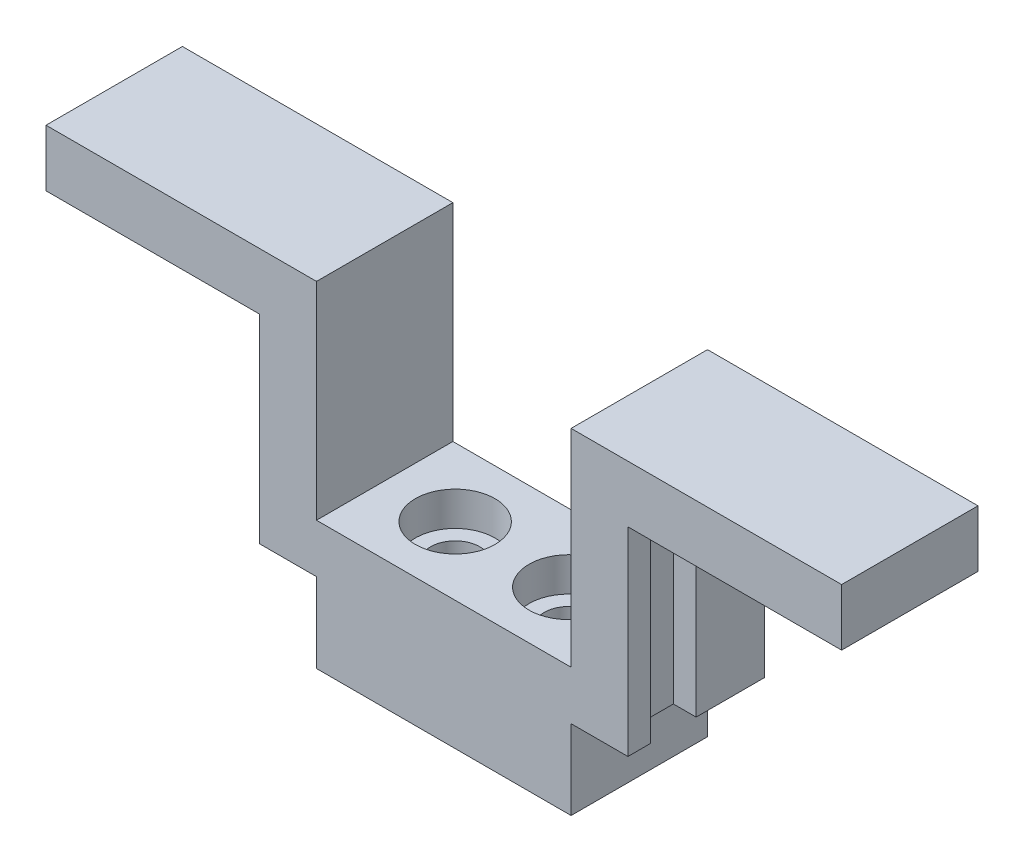
ISO-10303-21;
HEADER;
FILE_DESCRIPTION(('STEP AP214'),'2;1');
FILE_NAME('part.step','',(''),(''),'','','');
FILE_SCHEMA(('AUTOMOTIVE_DESIGN { 1 0 10303 214 1 1 1 1 }'));
ENDSEC;
DATA;
#1=APPLICATION_CONTEXT('core data for automotive mechanical design processes');
#2=APPLICATION_PROTOCOL_DEFINITION('international standard','automotive_design',2000,#1);
#3=PRODUCT_CONTEXT('',#1,'mechanical');
#4=PRODUCT('Part','Part','',(#3));
#5=PRODUCT_RELATED_PRODUCT_CATEGORY('part','',(#4));
#6=PRODUCT_DEFINITION_FORMATION('','',#4);
#7=PRODUCT_DEFINITION_CONTEXT('part definition',#1,'design');
#8=PRODUCT_DEFINITION('design','',#6,#7);
#9=PRODUCT_DEFINITION_SHAPE('','',#8);
#10=(LENGTH_UNIT() NAMED_UNIT(*) SI_UNIT(.MILLI.,.METRE.));
#11=(NAMED_UNIT(*) PLANE_ANGLE_UNIT() SI_UNIT($,.RADIAN.));
#12=(NAMED_UNIT(*) SI_UNIT($,.STERADIAN.) SOLID_ANGLE_UNIT());
#13=UNCERTAINTY_MEASURE_WITH_UNIT(LENGTH_MEASURE(1.E-05),#10,'distance_accuracy_value','');
#14=(GEOMETRIC_REPRESENTATION_CONTEXT(3) GLOBAL_UNCERTAINTY_ASSIGNED_CONTEXT((#13)) GLOBAL_UNIT_ASSIGNED_CONTEXT((#10,
#11,#12)) REPRESENTATION_CONTEXT('',''));
#15=CARTESIAN_POINT('',(0.,0.,0.));
#16=DIRECTION('',(0.,0.,1.));
#17=DIRECTION('',(1.,0.,0.));
#18=AXIS2_PLACEMENT_3D('',#15,#16,#17);
#19=CARTESIAN_POINT('',(-27.4,0.,12.));
#20=DIRECTION('',(-1.,0.,0.));
#21=DIRECTION('',(0.,0.,1.));
#22=AXIS2_PLACEMENT_3D('',#19,#20,#21);
#23=PLANE('',#22);
#24=DIRECTION('',(0.,0.,-1.));
#25=VECTOR('',#24,1.);
#26=CARTESIAN_POINT('',(-27.4,17.5,12.));
#27=LINE('',#26,#25);
#28=CARTESIAN_POINT('',(-27.4,17.5,12.));
#29=VERTEX_POINT('',#28);
#30=CARTESIAN_POINT('',(-27.4,17.5,10.));
#31=VERTEX_POINT('',#30);
#32=EDGE_CURVE('E304',#29,#31,#27,.T.);
#33=ORIENTED_EDGE('',*,*,#32,.T.);
#34=DIRECTION('',(0.,-1.,0.));
#35=VECTOR('',#34,1.);
#36=CARTESIAN_POINT('',(-27.4,17.5,10.));
#37=LINE('',#36,#35);
#38=CARTESIAN_POINT('',(-27.4,0.,10.));
#39=VERTEX_POINT('',#38);
#40=EDGE_CURVE('E217',#31,#39,#37,.T.);
#41=ORIENTED_EDGE('',*,*,#40,.T.);
#42=DIRECTION('',(0.,0.,-1.));
#43=VECTOR('',#42,1.);
#44=CARTESIAN_POINT('',(-27.4,0.,12.));
#45=LINE('',#44,#43);
#46=CARTESIAN_POINT('',(-27.4,0.,12.));
#47=VERTEX_POINT('',#46);
#48=EDGE_CURVE('E299',#47,#39,#45,.T.);
#49=ORIENTED_EDGE('',*,*,#48,.F.);
#50=DIRECTION('',(0.,1.,0.));
#51=VECTOR('',#50,1.);
#52=CARTESIAN_POINT('',(-27.4,0.,12.));
#53=LINE('',#52,#51);
#54=EDGE_CURVE('E266',#47,#29,#53,.T.);
#55=ORIENTED_EDGE('',*,*,#54,.T.);
#56=EDGE_LOOP('',(#33,#41,#49,#55));
#57=FACE_BOUND('',#56,.T.);
#58=ADVANCED_FACE('F39',(#57),#23,.T.);
#59=CARTESIAN_POINT('',(-27.4,0.,6.));
#60=VERTEX_POINT('',#59);
#61=CARTESIAN_POINT('',(-27.4,0.,0.));
#62=VERTEX_POINT('',#61);
#63=EDGE_CURVE('E298',#60,#62,#45,.T.);
#64=ORIENTED_EDGE('',*,*,#63,.F.);
#65=DIRECTION('',(0.,1.,0.));
#66=VECTOR('',#65,1.);
#67=CARTESIAN_POINT('',(-27.4,17.5,6.));
#68=LINE('',#67,#66);
#69=CARTESIAN_POINT('',(-27.4,17.5,6.));
#70=VERTEX_POINT('',#69);
#71=EDGE_CURVE('E225',#60,#70,#68,.T.);
#72=ORIENTED_EDGE('',*,*,#71,.T.);
#73=CARTESIAN_POINT('',(-27.4,17.5,0.));
#74=VERTEX_POINT('',#73);
#75=EDGE_CURVE('E303',#70,#74,#27,.T.);
#76=ORIENTED_EDGE('',*,*,#75,.T.);
#77=DIRECTION('',(0.,1.,0.));
#78=VECTOR('',#77,1.);
#79=CARTESIAN_POINT('',(-27.4,0.,0.));
#80=LINE('',#79,#78);
#81=EDGE_CURVE('E290',#62,#74,#80,.T.);
#82=ORIENTED_EDGE('',*,*,#81,.F.);
#83=EDGE_LOOP('',(#64,#72,#76,#82));
#84=FACE_BOUND('',#83,.T.);
#85=ADVANCED_FACE('F504',(#84),#23,.T.);
#86=CARTESIAN_POINT('',(-22.4,0.,12.));
#87=DIRECTION('',(0.,-1.,0.));
#88=DIRECTION('',(0.,0.,-1.));
#89=AXIS2_PLACEMENT_3D('',#86,#87,#88);
#90=PLANE('',#89);
#91=ORIENTED_EDGE('',*,*,#48,.T.);
#92=DIRECTION('',(-1.,0.,0.));
#93=VECTOR('',#92,1.);
#94=CARTESIAN_POINT('',(-25.4,0.,10.));
#95=LINE('',#94,#93);
#96=CARTESIAN_POINT('',(-25.4,0.,10.));
#97=VERTEX_POINT('',#96);
#98=EDGE_CURVE('E241',#97,#39,#95,.T.);
#99=ORIENTED_EDGE('',*,*,#98,.F.);
#100=DIRECTION('',(0.,0.,-1.));
#101=VECTOR('',#100,1.);
#102=CARTESIAN_POINT('',(-25.4,0.,10.));
#103=LINE('',#102,#101);
#104=CARTESIAN_POINT('',(-25.4,0.,6.));
#105=VERTEX_POINT('',#104);
#106=EDGE_CURVE('E220',#97,#105,#103,.T.);
#107=ORIENTED_EDGE('',*,*,#106,.T.);
#108=DIRECTION('',(-1.,0.,0.));
#109=VECTOR('',#108,1.);
#110=CARTESIAN_POINT('',(-25.4,0.,6.));
#111=LINE('',#110,#109);
#112=EDGE_CURVE('E245',#105,#60,#111,.T.);
#113=ORIENTED_EDGE('',*,*,#112,.T.);
#114=ORIENTED_EDGE('',*,*,#63,.T.);
#115=DIRECTION('',(-1.,0.,0.));
#116=VECTOR('',#115,1.);
#117=CARTESIAN_POINT('',(-22.4,0.,0.));
#118=LINE('',#117,#116);
#119=CARTESIAN_POINT('',(-22.4,0.,0.));
#120=VERTEX_POINT('',#119);
#121=EDGE_CURVE('E63',#120,#62,#118,.T.);
#122=ORIENTED_EDGE('',*,*,#121,.F.);
#123=DIRECTION('',(0.,0.,-1.));
#124=VECTOR('',#123,1.);
#125=CARTESIAN_POINT('',(-22.4,0.,12.));
#126=LINE('',#125,#124);
#127=CARTESIAN_POINT('',(-22.4,0.,12.));
#128=VERTEX_POINT('',#127);
#129=EDGE_CURVE('E274',#128,#120,#126,.T.);
#130=ORIENTED_EDGE('',*,*,#129,.F.);
#131=DIRECTION('',(-1.,0.,0.));
#132=VECTOR('',#131,1.);
#133=CARTESIAN_POINT('',(-22.4,0.,12.));
#134=LINE('',#133,#132);
#135=EDGE_CURVE('E270',#128,#47,#134,.T.);
#136=ORIENTED_EDGE('',*,*,#135,.T.);
#137=EDGE_LOOP('',(#91,#99,#107,#113,#114,#122,#130,#136));
#138=FACE_BOUND('',#137,.T.);
#139=ADVANCED_FACE('F502',(#138),#90,.T.);
#140=CARTESIAN_POINT('',(0.,17.5,12.));
#141=DIRECTION('',(1.,0.,0.));
#142=DIRECTION('',(0.,0.,-1.));
#143=AXIS2_PLACEMENT_3D('',#140,#141,#142);
#144=PLANE('',#143);
#145=DIRECTION('',(0.,0.,-1.));
#146=VECTOR('',#145,1.);
#147=CARTESIAN_POINT('',(0.,4.3,0.));
#148=LINE('',#147,#146);
#149=CARTESIAN_POINT('',(0.,4.3,12.));
#150=VERTEX_POINT('',#149);
#151=CARTESIAN_POINT('',(0.,4.3,0.));
#152=VERTEX_POINT('',#151);
#153=EDGE_CURVE('E340',#150,#152,#148,.T.);
#154=ORIENTED_EDGE('',*,*,#153,.F.);
#155=DIRECTION('',(0.,-1.,0.));
#156=VECTOR('',#155,1.);
#157=CARTESIAN_POINT('',(0.,0.,12.));
#158=LINE('',#157,#156);
#159=CARTESIAN_POINT('',(0.,22.5,12.));
#160=VERTEX_POINT('',#159);
#161=EDGE_CURVE('E397',#160,#150,#158,.T.);
#162=ORIENTED_EDGE('',*,*,#161,.F.);
#163=DIRECTION('',(0.,0.,-1.));
#164=VECTOR('',#163,1.);
#165=CARTESIAN_POINT('',(0.,22.5,12.));
#166=LINE('',#165,#164);
#167=CARTESIAN_POINT('',(0.,22.5,0.));
#168=VERTEX_POINT('',#167);
#169=EDGE_CURVE('E418',#160,#168,#166,.T.);
#170=ORIENTED_EDGE('',*,*,#169,.T.);
#171=DIRECTION('',(0.,-1.,0.));
#172=VECTOR('',#171,1.);
#173=CARTESIAN_POINT('',(0.,17.5,0.));
#174=LINE('',#173,#172);
#175=EDGE_CURVE('E402',#168,#152,#174,.T.);
#176=ORIENTED_EDGE('',*,*,#175,.T.);
#177=EDGE_LOOP('',(#154,#162,#170,#176));
#178=FACE_BOUND('',#177,.T.);
#179=ADVANCED_FACE('F534',(#178),#144,.F.);
#180=CARTESIAN_POINT('',(5.,0.,12.));
#181=DIRECTION('',(-1.,0.,0.));
#182=DIRECTION('',(0.,0.,1.));
#183=AXIS2_PLACEMENT_3D('',#180,#181,#182);
#184=PLANE('',#183);
#185=DIRECTION('',(0.,0.,-1.));
#186=VECTOR('',#185,1.);
#187=CARTESIAN_POINT('',(5.,0.,12.));
#188=LINE('',#187,#186);
#189=CARTESIAN_POINT('',(5.,0.,12.));
#190=VERTEX_POINT('',#189);
#191=CARTESIAN_POINT('',(5.,0.,10.));
#192=VERTEX_POINT('',#191);
#193=EDGE_CURVE('E48',#190,#192,#188,.T.);
#194=ORIENTED_EDGE('',*,*,#193,.T.);
#195=DIRECTION('',(0.,-1.,0.));
#196=VECTOR('',#195,1.);
#197=CARTESIAN_POINT('',(5.,17.5,10.));
#198=LINE('',#197,#196);
#199=CARTESIAN_POINT('',(5.,17.5,10.));
#200=VERTEX_POINT('',#199);
#201=EDGE_CURVE('E360',#200,#192,#198,.T.);
#202=ORIENTED_EDGE('',*,*,#201,.F.);
#203=DIRECTION('',(0.,0.,-1.));
#204=VECTOR('',#203,1.);
#205=CARTESIAN_POINT('',(5.,17.5,12.));
#206=LINE('',#205,#204);
#207=CARTESIAN_POINT('',(5.,17.5,12.));
#208=VERTEX_POINT('',#207);
#209=EDGE_CURVE('E449',#208,#200,#206,.T.);
#210=ORIENTED_EDGE('',*,*,#209,.F.);
#211=DIRECTION('',(0.,1.,0.));
#212=VECTOR('',#211,1.);
#213=CARTESIAN_POINT('',(5.,0.,12.));
#214=LINE('',#213,#212);
#215=EDGE_CURVE('E405',#190,#208,#214,.T.);
#216=ORIENTED_EDGE('',*,*,#215,.F.);
#217=EDGE_LOOP('',(#194,#202,#210,#216));
#218=FACE_BOUND('',#217,.T.);
#219=ADVANCED_FACE('F491',(#218),#184,.F.);
#220=CARTESIAN_POINT('',(0.,0.,12.));
#221=DIRECTION('',(0.,1.,0.));
#222=DIRECTION('',(0.,0.,1.));
#223=AXIS2_PLACEMENT_3D('',#220,#221,#222);
#224=PLANE('',#223);
#225=DIRECTION('',(0.,0.,-1.));
#226=VECTOR('',#225,1.);
#227=CARTESIAN_POINT('',(3.,0.,10.));
#228=LINE('',#227,#226);
#229=CARTESIAN_POINT('',(3.,0.,10.));
#230=VERTEX_POINT('',#229);
#231=CARTESIAN_POINT('',(3.,0.,6.));
#232=VERTEX_POINT('',#231);
#233=EDGE_CURVE('E365',#230,#232,#228,.T.);
#234=ORIENTED_EDGE('',*,*,#233,.F.);
#235=DIRECTION('',(1.,0.,0.));
#236=VECTOR('',#235,1.);
#237=CARTESIAN_POINT('',(3.,0.,10.));
#238=LINE('',#237,#236);
#239=EDGE_CURVE('E378',#230,#192,#238,.T.);
#240=ORIENTED_EDGE('',*,*,#239,.T.);
#241=ORIENTED_EDGE('',*,*,#193,.F.);
#242=DIRECTION('',(1.,0.,0.));
#243=VECTOR('',#242,1.);
#244=CARTESIAN_POINT('',(0.,0.,12.));
#245=LINE('',#244,#243);
#246=CARTESIAN_POINT('',(0.,0.,12.));
#247=VERTEX_POINT('',#246);
#248=EDGE_CURVE('E401',#247,#190,#245,.T.);
#249=ORIENTED_EDGE('',*,*,#248,.F.);
#250=DIRECTION('',(0.,0.,-1.));
#251=VECTOR('',#250,1.);
#252=CARTESIAN_POINT('',(0.,0.,12.));
#253=LINE('',#252,#251);
#254=CARTESIAN_POINT('',(0.,0.,0.));
#255=VERTEX_POINT('',#254);
#256=EDGE_CURVE('E11',#247,#255,#253,.T.);
#257=ORIENTED_EDGE('',*,*,#256,.T.);
#258=DIRECTION('',(1.,0.,0.));
#259=VECTOR('',#258,1.);
#260=CARTESIAN_POINT('',(0.,0.,0.));
#261=LINE('',#260,#259);
#262=CARTESIAN_POINT('',(5.,0.,0.));
#263=VERTEX_POINT('',#262);
#264=EDGE_CURVE('E386',#255,#263,#261,.T.);
#265=ORIENTED_EDGE('',*,*,#264,.T.);
#266=CARTESIAN_POINT('',(5.,0.,6.));
#267=VERTEX_POINT('',#266);
#268=EDGE_CURVE('E452',#267,#263,#188,.T.);
#269=ORIENTED_EDGE('',*,*,#268,.F.);
#270=DIRECTION('',(1.,0.,0.));
#271=VECTOR('',#270,1.);
#272=CARTESIAN_POINT('',(3.,0.,6.));
#273=LINE('',#272,#271);
#274=EDGE_CURVE('E391',#232,#267,#273,.T.);
#275=ORIENTED_EDGE('',*,*,#274,.F.);
#276=EDGE_LOOP('',(#234,#240,#241,#249,#257,#265,#269,#275));
#277=FACE_BOUND('',#276,.T.);
#278=ADVANCED_FACE('F41',(#277),#224,.F.);
#279=CARTESIAN_POINT('',(5.,17.5,6.));
#280=VERTEX_POINT('',#279);
#281=CARTESIAN_POINT('',(5.,17.5,0.));
#282=VERTEX_POINT('',#281);
#283=EDGE_CURVE('E448',#280,#282,#206,.T.);
#284=ORIENTED_EDGE('',*,*,#283,.F.);
#285=DIRECTION('',(0.,1.,0.));
#286=VECTOR('',#285,1.);
#287=CARTESIAN_POINT('',(5.,17.5,6.));
#288=LINE('',#287,#286);
#289=EDGE_CURVE('E366',#267,#280,#288,.T.);
#290=ORIENTED_EDGE('',*,*,#289,.F.);
#291=ORIENTED_EDGE('',*,*,#268,.T.);
#292=DIRECTION('',(0.,1.,0.));
#293=VECTOR('',#292,1.);
#294=CARTESIAN_POINT('',(5.,0.,0.));
#295=LINE('',#294,#293);
#296=EDGE_CURVE('E422',#263,#282,#295,.T.);
#297=ORIENTED_EDGE('',*,*,#296,.T.);
#298=EDGE_LOOP('',(#284,#290,#291,#297));
#299=FACE_BOUND('',#298,.T.);
#300=ADVANCED_FACE('F464',(#299),#184,.F.);
#301=CARTESIAN_POINT('',(5.,17.5,12.));
#302=DIRECTION('',(0.,1.,0.));
#303=DIRECTION('',(0.,0.,1.));
#304=AXIS2_PLACEMENT_3D('',#301,#302,#303);
#305=PLANE('',#304);
#306=DIRECTION('',(1.,0.,0.));
#307=VECTOR('',#306,1.);
#308=CARTESIAN_POINT('',(5.,17.5,0.));
#309=LINE('',#308,#307);
#310=CARTESIAN_POINT('',(23.8,17.5,0.));
#311=VERTEX_POINT('',#310);
#312=EDGE_CURVE('E426',#282,#311,#309,.T.);
#313=ORIENTED_EDGE('',*,*,#312,.T.);
#314=DIRECTION('',(0.,0.,-1.));
#315=VECTOR('',#314,1.);
#316=CARTESIAN_POINT('',(23.8,17.5,12.));
#317=LINE('',#316,#315);
#318=CARTESIAN_POINT('',(23.8,17.5,12.));
#319=VERTEX_POINT('',#318);
#320=EDGE_CURVE('E444',#319,#311,#317,.T.);
#321=ORIENTED_EDGE('',*,*,#320,.F.);
#322=DIRECTION('',(1.,0.,0.));
#323=VECTOR('',#322,1.);
#324=CARTESIAN_POINT('',(5.,17.5,12.));
#325=LINE('',#324,#323);
#326=EDGE_CURVE('E408',#208,#319,#325,.T.);
#327=ORIENTED_EDGE('',*,*,#326,.F.);
#328=ORIENTED_EDGE('',*,*,#209,.T.);
#329=DIRECTION('',(1.,0.,0.));
#330=VECTOR('',#329,1.);
#331=CARTESIAN_POINT('',(3.,17.5,10.));
#332=LINE('',#331,#330);
#333=CARTESIAN_POINT('',(3.,17.5,10.));
#334=VERTEX_POINT('',#333);
#335=EDGE_CURVE('E383',#334,#200,#332,.T.);
#336=ORIENTED_EDGE('',*,*,#335,.F.);
#337=DIRECTION('',(0.,0.,1.));
#338=VECTOR('',#337,1.);
#339=CARTESIAN_POINT('',(3.,17.5,10.));
#340=LINE('',#339,#338);
#341=CARTESIAN_POINT('',(3.,17.5,6.));
#342=VERTEX_POINT('',#341);
#343=EDGE_CURVE('E374',#342,#334,#340,.T.);
#344=ORIENTED_EDGE('',*,*,#343,.F.);
#345=DIRECTION('',(1.,0.,0.));
#346=VECTOR('',#345,1.);
#347=CARTESIAN_POINT('',(3.,17.5,6.));
#348=LINE('',#347,#346);
#349=EDGE_CURVE('E387',#342,#280,#348,.T.);
#350=ORIENTED_EDGE('',*,*,#349,.T.);
#351=ORIENTED_EDGE('',*,*,#283,.T.);
#352=EDGE_LOOP('',(#313,#321,#327,#328,#336,#344,#350,#351));
#353=FACE_BOUND('',#352,.T.);
#354=ADVANCED_FACE('F478',(#353),#305,.F.);
#355=CARTESIAN_POINT('',(23.8,17.5,12.));
#356=DIRECTION('',(-1.,0.,0.));
#357=DIRECTION('',(0.,0.,1.));
#358=AXIS2_PLACEMENT_3D('',#355,#356,#357);
#359=PLANE('',#358);
#360=DIRECTION('',(0.,1.,0.));
#361=VECTOR('',#360,1.);
#362=CARTESIAN_POINT('',(23.8,17.5,0.));
#363=LINE('',#362,#361);
#364=CARTESIAN_POINT('',(23.8,22.5,0.));
#365=VERTEX_POINT('',#364);
#366=EDGE_CURVE('E429',#311,#365,#363,.T.);
#367=ORIENTED_EDGE('',*,*,#366,.T.);
#368=DIRECTION('',(0.,0.,-1.));
#369=VECTOR('',#368,1.);
#370=CARTESIAN_POINT('',(23.8,22.5,12.));
#371=LINE('',#370,#369);
#372=CARTESIAN_POINT('',(23.8,22.5,12.));
#373=VERTEX_POINT('',#372);
#374=EDGE_CURVE('E440',#373,#365,#371,.T.);
#375=ORIENTED_EDGE('',*,*,#374,.F.);
#376=DIRECTION('',(0.,1.,0.));
#377=VECTOR('',#376,1.);
#378=CARTESIAN_POINT('',(23.8,17.5,12.));
#379=LINE('',#378,#377);
#380=EDGE_CURVE('E411',#319,#373,#379,.T.);
#381=ORIENTED_EDGE('',*,*,#380,.F.);
#382=ORIENTED_EDGE('',*,*,#320,.T.);
#383=EDGE_LOOP('',(#367,#375,#381,#382));
#384=FACE_BOUND('',#383,.T.);
#385=ADVANCED_FACE('F482',(#384),#359,.F.);
#386=CARTESIAN_POINT('',(0.,22.5,12.));
#387=DIRECTION('',(0.,-1.,0.));
#388=DIRECTION('',(0.,0.,-1.));
#389=AXIS2_PLACEMENT_3D('',#386,#387,#388);
#390=PLANE('',#389);
#391=DIRECTION('',(-1.,0.,0.));
#392=VECTOR('',#391,1.);
#393=CARTESIAN_POINT('',(0.,22.5,0.));
#394=LINE('',#393,#392);
#395=EDGE_CURVE('E432',#365,#168,#394,.T.);
#396=ORIENTED_EDGE('',*,*,#395,.T.);
#397=ORIENTED_EDGE('',*,*,#169,.F.);
#398=DIRECTION('',(-1.,0.,0.));
#399=VECTOR('',#398,1.);
#400=CARTESIAN_POINT('',(0.,22.5,12.));
#401=LINE('',#400,#399);
#402=EDGE_CURVE('E414',#373,#160,#401,.T.);
#403=ORIENTED_EDGE('',*,*,#402,.F.);
#404=ORIENTED_EDGE('',*,*,#374,.T.);
#405=EDGE_LOOP('',(#396,#397,#403,#404));
#406=FACE_BOUND('',#405,.T.);
#407=ADVANCED_FACE('F536',(#406),#390,.F.);
#408=CARTESIAN_POINT('',(0.,0.,12.));
#409=DIRECTION('',(0.,0.,-1.));
#410=DIRECTION('',(-1.,0.,0.));
#411=AXIS2_PLACEMENT_3D('',#408,#409,#410);
#412=PLANE('',#411);
#413=ORIENTED_EDGE('',*,*,#161,.T.);
#414=DIRECTION('',(1.,0.,0.));
#415=VECTOR('',#414,1.);
#416=CARTESIAN_POINT('',(-11.2,4.3,12.));
#417=LINE('',#416,#415);
#418=CARTESIAN_POINT('',(-22.4,4.3,12.));
#419=VERTEX_POINT('',#418);
#420=EDGE_CURVE('E348',#419,#150,#417,.T.);
#421=ORIENTED_EDGE('',*,*,#420,.F.);
#422=DIRECTION('',(0.,-1.,0.));
#423=VECTOR('',#422,1.);
#424=CARTESIAN_POINT('',(-22.4,0.,12.));
#425=LINE('',#424,#423);
#426=CARTESIAN_POINT('',(-22.4,22.5,12.));
#427=VERTEX_POINT('',#426);
#428=EDGE_CURVE('E251',#427,#419,#425,.T.);
#429=ORIENTED_EDGE('',*,*,#428,.F.);
#430=DIRECTION('',(1.,0.,0.));
#431=VECTOR('',#430,1.);
#432=CARTESIAN_POINT('',(-22.4,22.5,12.));
#433=LINE('',#432,#431);
#434=CARTESIAN_POINT('',(-46.2,22.5,12.));
#435=VERTEX_POINT('',#434);
#436=EDGE_CURVE('E254',#435,#427,#433,.T.);
#437=ORIENTED_EDGE('',*,*,#436,.F.);
#438=DIRECTION('',(0.,1.,0.));
#439=VECTOR('',#438,1.);
#440=CARTESIAN_POINT('',(-46.2,17.5,12.));
#441=LINE('',#440,#439);
#442=CARTESIAN_POINT('',(-46.2,17.5,12.));
#443=VERTEX_POINT('',#442);
#444=EDGE_CURVE('E258',#443,#435,#441,.T.);
#445=ORIENTED_EDGE('',*,*,#444,.F.);
#446=DIRECTION('',(-1.,0.,0.));
#447=VECTOR('',#446,1.);
#448=CARTESIAN_POINT('',(-27.4,17.5,12.));
#449=LINE('',#448,#447);
#450=EDGE_CURVE('E262',#29,#443,#449,.T.);
#451=ORIENTED_EDGE('',*,*,#450,.F.);
#452=ORIENTED_EDGE('',*,*,#54,.F.);
#453=ORIENTED_EDGE('',*,*,#135,.F.);
#454=DIRECTION('',(0.,1.,0.));
#455=VECTOR('',#454,1.);
#456=CARTESIAN_POINT('',(-22.4,4.3,12.));
#457=LINE('',#456,#455);
#458=CARTESIAN_POINT('',(-22.4,-7.,12.));
#459=VERTEX_POINT('',#458);
#460=EDGE_CURVE('E322',#459,#128,#457,.T.);
#461=ORIENTED_EDGE('',*,*,#460,.F.);
#462=DIRECTION('',(1.,0.,0.));
#463=VECTOR('',#462,1.);
#464=CARTESIAN_POINT('',(-11.2,-7.,12.));
#465=LINE('',#464,#463);
#466=CARTESIAN_POINT('',(0.,-7.,12.));
#467=VERTEX_POINT('',#466);
#468=EDGE_CURVE('E352',#459,#467,#465,.T.);
#469=ORIENTED_EDGE('',*,*,#468,.T.);
#470=DIRECTION('',(0.,1.,0.));
#471=VECTOR('',#470,1.);
#472=CARTESIAN_POINT('',(0.,4.3,12.));
#473=LINE('',#472,#471);
#474=EDGE_CURVE('E336',#467,#247,#473,.T.);
#475=ORIENTED_EDGE('',*,*,#474,.T.);
#476=ORIENTED_EDGE('',*,*,#248,.T.);
#477=ORIENTED_EDGE('',*,*,#215,.T.);
#478=ORIENTED_EDGE('',*,*,#326,.T.);
#479=ORIENTED_EDGE('',*,*,#380,.T.);
#480=ORIENTED_EDGE('',*,*,#402,.T.);
#481=EDGE_LOOP('',(#413,#421,#429,#437,#445,#451,#452,#453,#461,#469,#475,#476,#477,#478,#479,#480));
#482=FACE_BOUND('',#481,.T.);
#483=ADVANCED_FACE('F486',(#482),#412,.F.);
#484=CARTESIAN_POINT('',(0.,0.,0.));
#485=DIRECTION('',(0.,0.,-1.));
#486=DIRECTION('',(-1.,0.,0.));
#487=AXIS2_PLACEMENT_3D('',#484,#485,#486);
#488=PLANE('',#487);
#489=ORIENTED_EDGE('',*,*,#264,.F.);
#490=DIRECTION('',(0.,-1.,0.));
#491=VECTOR('',#490,1.);
#492=CARTESIAN_POINT('',(0.,4.3,0.));
#493=LINE('',#492,#491);
#494=CARTESIAN_POINT('',(0.,-7.,0.));
#495=VERTEX_POINT('',#494);
#496=EDGE_CURVE('E330',#255,#495,#493,.T.);
#497=ORIENTED_EDGE('',*,*,#496,.T.);
#498=DIRECTION('',(1.,0.,0.));
#499=VECTOR('',#498,1.);
#500=CARTESIAN_POINT('',(-11.2,-7.,0.));
#501=LINE('',#500,#499);
#502=CARTESIAN_POINT('',(-22.4,-7.,0.));
#503=VERTEX_POINT('',#502);
#504=EDGE_CURVE('E356',#503,#495,#501,.T.);
#505=ORIENTED_EDGE('',*,*,#504,.F.);
#506=DIRECTION('',(0.,-1.,0.));
#507=VECTOR('',#506,1.);
#508=CARTESIAN_POINT('',(-22.4,4.3,0.));
#509=LINE('',#508,#507);
#510=EDGE_CURVE('E316',#120,#503,#509,.T.);
#511=ORIENTED_EDGE('',*,*,#510,.F.);
#512=ORIENTED_EDGE('',*,*,#121,.T.);
#513=ORIENTED_EDGE('',*,*,#81,.T.);
#514=DIRECTION('',(-1.,0.,0.));
#515=VECTOR('',#514,1.);
#516=CARTESIAN_POINT('',(-27.4,17.5,0.));
#517=LINE('',#516,#515);
#518=CARTESIAN_POINT('',(-46.2,17.5,0.));
#519=VERTEX_POINT('',#518);
#520=EDGE_CURVE('E286',#74,#519,#517,.T.);
#521=ORIENTED_EDGE('',*,*,#520,.T.);
#522=DIRECTION('',(0.,1.,0.));
#523=VECTOR('',#522,1.);
#524=CARTESIAN_POINT('',(-46.2,17.5,0.));
#525=LINE('',#524,#523);
#526=CARTESIAN_POINT('',(-46.2,22.5,0.));
#527=VERTEX_POINT('',#526);
#528=EDGE_CURVE('E282',#519,#527,#525,.T.);
#529=ORIENTED_EDGE('',*,*,#528,.T.);
#530=DIRECTION('',(1.,0.,0.));
#531=VECTOR('',#530,1.);
#532=CARTESIAN_POINT('',(-22.4,22.5,0.));
#533=LINE('',#532,#531);
#534=CARTESIAN_POINT('',(-22.4,22.5,0.));
#535=VERTEX_POINT('',#534);
#536=EDGE_CURVE('E278',#527,#535,#533,.T.);
#537=ORIENTED_EDGE('',*,*,#536,.T.);
#538=DIRECTION('',(0.,-1.,0.));
#539=VECTOR('',#538,1.);
#540=CARTESIAN_POINT('',(-22.4,17.5,0.));
#541=LINE('',#540,#539);
#542=CARTESIAN_POINT('',(-22.4,4.3,0.));
#543=VERTEX_POINT('',#542);
#544=EDGE_CURVE('E244',#535,#543,#541,.T.);
#545=ORIENTED_EDGE('',*,*,#544,.T.);
#546=DIRECTION('',(1.,0.,0.));
#547=VECTOR('',#546,1.);
#548=CARTESIAN_POINT('',(-11.2,4.3,0.));
#549=LINE('',#548,#547);
#550=EDGE_CURVE('E344',#543,#152,#549,.T.);
#551=ORIENTED_EDGE('',*,*,#550,.T.);
#552=ORIENTED_EDGE('',*,*,#175,.F.);
#553=ORIENTED_EDGE('',*,*,#395,.F.);
#554=ORIENTED_EDGE('',*,*,#366,.F.);
#555=ORIENTED_EDGE('',*,*,#312,.F.);
#556=ORIENTED_EDGE('',*,*,#296,.F.);
#557=EDGE_LOOP('',(#489,#497,#505,#511,#512,#513,#521,#529,#537,#545,#551,#552,#553,#554,#555,#556));
#558=FACE_BOUND('',#557,.T.);
#559=ADVANCED_FACE('F473',(#558),#488,.T.);
#560=CARTESIAN_POINT('',(3.,17.5,10.));
#561=DIRECTION('',(0.,0.,1.));
#562=DIRECTION('',(0.,-1.,0.));
#563=AXIS2_PLACEMENT_3D('',#560,#561,#562);
#564=PLANE('',#563);
#565=ORIENTED_EDGE('',*,*,#201,.T.);
#566=ORIENTED_EDGE('',*,*,#239,.F.);
#567=DIRECTION('',(0.,-1.,0.));
#568=VECTOR('',#567,1.);
#569=CARTESIAN_POINT('',(3.,17.5,10.));
#570=LINE('',#569,#568);
#571=EDGE_CURVE('E361',#334,#230,#570,.T.);
#572=ORIENTED_EDGE('',*,*,#571,.F.);
#573=ORIENTED_EDGE('',*,*,#335,.T.);
#574=EDGE_LOOP('',(#565,#566,#572,#573));
#575=FACE_BOUND('',#574,.T.);
#576=ADVANCED_FACE('F493',(#575),#564,.F.);
#577=CARTESIAN_POINT('',(3.,17.5,6.));
#578=DIRECTION('',(0.,0.,-1.));
#579=DIRECTION('',(0.,1.,0.));
#580=AXIS2_PLACEMENT_3D('',#577,#578,#579);
#581=PLANE('',#580);
#582=ORIENTED_EDGE('',*,*,#289,.T.);
#583=ORIENTED_EDGE('',*,*,#349,.F.);
#584=DIRECTION('',(0.,1.,0.));
#585=VECTOR('',#584,1.);
#586=CARTESIAN_POINT('',(3.,17.5,6.));
#587=LINE('',#586,#585);
#588=EDGE_CURVE('E370',#232,#342,#587,.T.);
#589=ORIENTED_EDGE('',*,*,#588,.F.);
#590=ORIENTED_EDGE('',*,*,#274,.T.);
#591=EDGE_LOOP('',(#582,#583,#589,#590));
#592=FACE_BOUND('',#591,.T.);
#593=ADVANCED_FACE('F577',(#592),#581,.F.);
#594=CARTESIAN_POINT('',(3.,0.,0.));
#595=DIRECTION('',(1.,0.,0.));
#596=DIRECTION('',(0.,0.,-1.));
#597=AXIS2_PLACEMENT_3D('',#594,#595,#596);
#598=PLANE('',#597);
#599=ORIENTED_EDGE('',*,*,#571,.T.);
#600=ORIENTED_EDGE('',*,*,#233,.T.);
#601=ORIENTED_EDGE('',*,*,#588,.T.);
#602=ORIENTED_EDGE('',*,*,#343,.T.);
#603=EDGE_LOOP('',(#599,#600,#601,#602));
#604=FACE_BOUND('',#603,.T.);
#605=ADVANCED_FACE('F495',(#604),#598,.T.);
#606=CARTESIAN_POINT('',(-11.2,-7.,0.));
#607=DIRECTION('',(0.,1.,0.));
#608=DIRECTION('',(0.,0.,1.));
#609=AXIS2_PLACEMENT_3D('',#606,#607,#608);
#610=PLANE('',#609);
#611=CARTESIAN_POINT('',(-16.2,-7.,6.));
#612=DIRECTION('',(0.,1.,0.));
#613=DIRECTION('',(0.,0.,1.));
#614=AXIS2_PLACEMENT_3D('',#611,#612,#613);
#615=CIRCLE('',#614,2.165);
#616=CARTESIAN_POINT('',(-16.2,-7.,8.165));
#617=VERTEX_POINT('',#616);
#618=EDGE_CURVE('E842',#617,#617,#615,.T.);
#619=ORIENTED_EDGE('',*,*,#618,.T.);
#620=EDGE_LOOP('',(#619));
#621=FACE_BOUND('',#620,.T.);
#622=CARTESIAN_POINT('',(-6.2,-7.,6.));
#623=DIRECTION('',(0.,1.,0.));
#624=DIRECTION('',(0.,0.,1.));
#625=AXIS2_PLACEMENT_3D('',#622,#623,#624);
#626=CIRCLE('',#625,2.165);
#627=CARTESIAN_POINT('',(-6.2,-7.,8.165));
#628=VERTEX_POINT('',#627);
#629=EDGE_CURVE('E847',#628,#628,#626,.T.);
#630=ORIENTED_EDGE('',*,*,#629,.T.);
#631=EDGE_LOOP('',(#630));
#632=FACE_BOUND('',#631,.T.);
#633=DIRECTION('',(0.,0.,1.));
#634=VECTOR('',#633,1.);
#635=CARTESIAN_POINT('',(0.,-7.,0.));
#636=LINE('',#635,#634);
#637=EDGE_CURVE('E333',#495,#467,#636,.T.);
#638=ORIENTED_EDGE('',*,*,#637,.T.);
#639=ORIENTED_EDGE('',*,*,#468,.F.);
#640=DIRECTION('',(0.,0.,1.));
#641=VECTOR('',#640,1.);
#642=CARTESIAN_POINT('',(-22.4,-7.,0.));
#643=LINE('',#642,#641);
#644=EDGE_CURVE('E326',#503,#459,#643,.T.);
#645=ORIENTED_EDGE('',*,*,#644,.F.);
#646=ORIENTED_EDGE('',*,*,#504,.T.);
#647=EDGE_LOOP('',(#638,#639,#645,#646));
#648=FACE_BOUND('',#647,.T.);
#649=ADVANCED_FACE('F570',(#621,#632,#648),#610,.F.);
#650=CARTESIAN_POINT('',(-11.2,4.3,0.));
#651=DIRECTION('',(0.,-1.,0.));
#652=DIRECTION('',(0.,0.,-1.));
#653=AXIS2_PLACEMENT_3D('',#650,#651,#652);
#654=PLANE('',#653);
#655=CARTESIAN_POINT('',(-16.2,4.3,6.));
#656=DIRECTION('',(0.,1.,0.));
#657=DIRECTION('',(0.,0.,1.));
#658=AXIS2_PLACEMENT_3D('',#655,#656,#657);
#659=CIRCLE('',#658,3.5);
#660=CARTESIAN_POINT('',(-16.2,4.3,9.5));
#661=VERTEX_POINT('',#660);
#662=EDGE_CURVE('E862',#661,#661,#659,.T.);
#663=ORIENTED_EDGE('',*,*,#662,.F.);
#664=EDGE_LOOP('',(#663));
#665=FACE_BOUND('',#664,.T.);
#666=CARTESIAN_POINT('',(-6.2,4.3,6.));
#667=DIRECTION('',(0.,1.,0.));
#668=DIRECTION('',(0.,0.,1.));
#669=AXIS2_PLACEMENT_3D('',#666,#667,#668);
#670=CIRCLE('',#669,3.5);
#671=CARTESIAN_POINT('',(-6.2,4.3,9.5));
#672=VERTEX_POINT('',#671);
#673=EDGE_CURVE('E231',#672,#672,#670,.T.);
#674=ORIENTED_EDGE('',*,*,#673,.F.);
#675=EDGE_LOOP('',(#674));
#676=FACE_BOUND('',#675,.T.);
#677=ORIENTED_EDGE('',*,*,#153,.T.);
#678=ORIENTED_EDGE('',*,*,#550,.F.);
#679=DIRECTION('',(0.,0.,-1.));
#680=VECTOR('',#679,1.);
#681=CARTESIAN_POINT('',(-22.4,4.3,0.));
#682=LINE('',#681,#680);
#683=EDGE_CURVE('E319',#419,#543,#682,.T.);
#684=ORIENTED_EDGE('',*,*,#683,.F.);
#685=ORIENTED_EDGE('',*,*,#420,.T.);
#686=EDGE_LOOP('',(#677,#678,#684,#685));
#687=FACE_BOUND('',#686,.T.);
#688=ADVANCED_FACE('F531',(#665,#676,#687),#654,.F.);
#689=CARTESIAN_POINT('',(0.,0.,0.));
#690=DIRECTION('',(-1.,0.,0.));
#691=DIRECTION('',(0.,0.,1.));
#692=AXIS2_PLACEMENT_3D('',#689,#690,#691);
#693=PLANE('',#692);
#694=ORIENTED_EDGE('',*,*,#256,.F.);
#695=ORIENTED_EDGE('',*,*,#474,.F.);
#696=ORIENTED_EDGE('',*,*,#637,.F.);
#697=ORIENTED_EDGE('',*,*,#496,.F.);
#698=EDGE_LOOP('',(#694,#695,#696,#697));
#699=FACE_BOUND('',#698,.T.);
#700=ADVANCED_FACE('F564',(#699),#693,.F.);
#701=CARTESIAN_POINT('',(-22.4,0.,0.));
#702=DIRECTION('',(1.,0.,0.));
#703=DIRECTION('',(0.,0.,1.));
#704=AXIS2_PLACEMENT_3D('',#701,#702,#703);
#705=PLANE('',#704);
#706=ORIENTED_EDGE('',*,*,#460,.T.);
#707=ORIENTED_EDGE('',*,*,#129,.T.);
#708=ORIENTED_EDGE('',*,*,#510,.T.);
#709=ORIENTED_EDGE('',*,*,#644,.T.);
#710=EDGE_LOOP('',(#706,#707,#708,#709));
#711=FACE_BOUND('',#710,.T.);
#712=ADVANCED_FACE('F509',(#711),#705,.F.);
#713=CARTESIAN_POINT('',(-22.4,17.5,12.));
#714=DIRECTION('',(1.,0.,0.));
#715=DIRECTION('',(0.,0.,-1.));
#716=AXIS2_PLACEMENT_3D('',#713,#714,#715);
#717=PLANE('',#716);
#718=ORIENTED_EDGE('',*,*,#428,.T.);
#719=ORIENTED_EDGE('',*,*,#683,.T.);
#720=ORIENTED_EDGE('',*,*,#544,.F.);
#721=DIRECTION('',(0.,0.,-1.));
#722=VECTOR('',#721,1.);
#723=CARTESIAN_POINT('',(-22.4,22.5,12.));
#724=LINE('',#723,#722);
#725=EDGE_CURVE('E313',#427,#535,#724,.T.);
#726=ORIENTED_EDGE('',*,*,#725,.F.);
#727=EDGE_LOOP('',(#718,#719,#720,#726));
#728=FACE_BOUND('',#727,.T.);
#729=ADVANCED_FACE('F527',(#728),#717,.T.);
#730=CARTESIAN_POINT('',(-22.4,22.5,12.));
#731=DIRECTION('',(0.,1.,0.));
#732=DIRECTION('',(0.,0.,1.));
#733=AXIS2_PLACEMENT_3D('',#730,#731,#732);
#734=PLANE('',#733);
#735=ORIENTED_EDGE('',*,*,#536,.F.);
#736=DIRECTION('',(0.,0.,-1.));
#737=VECTOR('',#736,1.);
#738=CARTESIAN_POINT('',(-46.2,22.5,12.));
#739=LINE('',#738,#737);
#740=EDGE_CURVE('E310',#435,#527,#739,.T.);
#741=ORIENTED_EDGE('',*,*,#740,.F.);
#742=ORIENTED_EDGE('',*,*,#436,.T.);
#743=ORIENTED_EDGE('',*,*,#725,.T.);
#744=EDGE_LOOP('',(#735,#741,#742,#743));
#745=FACE_BOUND('',#744,.T.);
#746=ADVANCED_FACE('F523',(#745),#734,.T.);
#747=CARTESIAN_POINT('',(-46.2,17.5,12.));
#748=DIRECTION('',(-1.,0.,0.));
#749=DIRECTION('',(0.,0.,1.));
#750=AXIS2_PLACEMENT_3D('',#747,#748,#749);
#751=PLANE('',#750);
#752=ORIENTED_EDGE('',*,*,#528,.F.);
#753=DIRECTION('',(0.,0.,-1.));
#754=VECTOR('',#753,1.);
#755=CARTESIAN_POINT('',(-46.2,17.5,12.));
#756=LINE('',#755,#754);
#757=EDGE_CURVE('E307',#443,#519,#756,.T.);
#758=ORIENTED_EDGE('',*,*,#757,.F.);
#759=ORIENTED_EDGE('',*,*,#444,.T.);
#760=ORIENTED_EDGE('',*,*,#740,.T.);
#761=EDGE_LOOP('',(#752,#758,#759,#760));
#762=FACE_BOUND('',#761,.T.);
#763=ADVANCED_FACE('F518',(#762),#751,.T.);
#764=CARTESIAN_POINT('',(-27.4,17.5,12.));
#765=DIRECTION('',(0.,-1.,0.));
#766=DIRECTION('',(0.,0.,-1.));
#767=AXIS2_PLACEMENT_3D('',#764,#765,#766);
#768=PLANE('',#767);
#769=ORIENTED_EDGE('',*,*,#520,.F.);
#770=ORIENTED_EDGE('',*,*,#75,.F.);
#771=DIRECTION('',(-1.,0.,0.));
#772=VECTOR('',#771,1.);
#773=CARTESIAN_POINT('',(-25.4,17.5,6.));
#774=LINE('',#773,#772);
#775=CARTESIAN_POINT('',(-25.4,17.5,6.));
#776=VERTEX_POINT('',#775);
#777=EDGE_CURVE('E207',#776,#70,#774,.T.);
#778=ORIENTED_EDGE('',*,*,#777,.F.);
#779=DIRECTION('',(0.,0.,1.));
#780=VECTOR('',#779,1.);
#781=CARTESIAN_POINT('',(-25.4,17.5,10.));
#782=LINE('',#781,#780);
#783=CARTESIAN_POINT('',(-25.4,17.5,10.));
#784=VERTEX_POINT('',#783);
#785=EDGE_CURVE('E200',#776,#784,#782,.T.);
#786=ORIENTED_EDGE('',*,*,#785,.T.);
#787=DIRECTION('',(-1.,0.,0.));
#788=VECTOR('',#787,1.);
#789=CARTESIAN_POINT('',(-25.4,17.5,10.));
#790=LINE('',#789,#788);
#791=EDGE_CURVE('E204',#784,#31,#790,.T.);
#792=ORIENTED_EDGE('',*,*,#791,.T.);
#793=ORIENTED_EDGE('',*,*,#32,.F.);
#794=ORIENTED_EDGE('',*,*,#450,.T.);
#795=ORIENTED_EDGE('',*,*,#757,.T.);
#796=EDGE_LOOP('',(#769,#770,#778,#786,#792,#793,#794,#795));
#797=FACE_BOUND('',#796,.T.);
#798=ADVANCED_FACE('F203',(#797),#768,.T.);
#799=CARTESIAN_POINT('',(-25.4,17.5,10.));
#800=DIRECTION('',(0.,0.,-1.));
#801=DIRECTION('',(0.,1.,0.));
#802=AXIS2_PLACEMENT_3D('',#799,#800,#801);
#803=PLANE('',#802);
#804=ORIENTED_EDGE('',*,*,#40,.F.);
#805=ORIENTED_EDGE('',*,*,#791,.F.);
#806=DIRECTION('',(0.,-1.,0.));
#807=VECTOR('',#806,1.);
#808=CARTESIAN_POINT('',(-25.4,17.5,10.));
#809=LINE('',#808,#807);
#810=EDGE_CURVE('E210',#784,#97,#809,.T.);
#811=ORIENTED_EDGE('',*,*,#810,.T.);
#812=ORIENTED_EDGE('',*,*,#98,.T.);
#813=EDGE_LOOP('',(#804,#805,#811,#812));
#814=FACE_BOUND('',#813,.T.);
#815=ADVANCED_FACE('F214',(#814),#803,.T.);
#816=CARTESIAN_POINT('',(-25.4,17.5,6.));
#817=DIRECTION('',(0.,0.,1.));
#818=DIRECTION('',(0.,-1.,0.));
#819=AXIS2_PLACEMENT_3D('',#816,#817,#818);
#820=PLANE('',#819);
#821=ORIENTED_EDGE('',*,*,#71,.F.);
#822=ORIENTED_EDGE('',*,*,#112,.F.);
#823=DIRECTION('',(0.,1.,0.));
#824=VECTOR('',#823,1.);
#825=CARTESIAN_POINT('',(-25.4,17.5,6.));
#826=LINE('',#825,#824);
#827=EDGE_CURVE('E55',#105,#776,#826,.T.);
#828=ORIENTED_EDGE('',*,*,#827,.T.);
#829=ORIENTED_EDGE('',*,*,#777,.T.);
#830=EDGE_LOOP('',(#821,#822,#828,#829));
#831=FACE_BOUND('',#830,.T.);
#832=ADVANCED_FACE('F815',(#831),#820,.T.);
#833=CARTESIAN_POINT('',(-25.4,0.,0.));
#834=DIRECTION('',(-1.,0.,0.));
#835=DIRECTION('',(0.,0.,-1.));
#836=AXIS2_PLACEMENT_3D('',#833,#834,#835);
#837=PLANE('',#836);
#838=ORIENTED_EDGE('',*,*,#810,.F.);
#839=ORIENTED_EDGE('',*,*,#785,.F.);
#840=ORIENTED_EDGE('',*,*,#827,.F.);
#841=ORIENTED_EDGE('',*,*,#106,.F.);
#842=EDGE_LOOP('',(#838,#839,#840,#841));
#843=FACE_BOUND('',#842,.T.);
#844=ADVANCED_FACE('F222',(#843),#837,.T.);
#845=CARTESIAN_POINT('',(-6.2,1.3,6.));
#846=DIRECTION('',(0.,1.,0.));
#847=DIRECTION('',(0.,0.,1.));
#848=AXIS2_PLACEMENT_3D('',#845,#846,#847);
#849=CYLINDRICAL_SURFACE('',#848,3.5);
#850=CARTESIAN_POINT('',(-6.2,1.3,6.));
#851=DIRECTION('',(0.,1.,0.));
#852=DIRECTION('',(0.,0.,1.));
#853=AXIS2_PLACEMENT_3D('',#850,#851,#852);
#854=CIRCLE('',#853,3.5);
#855=CARTESIAN_POINT('',(-6.2,1.3,9.5));
#856=VERTEX_POINT('',#855);
#857=EDGE_CURVE('E865',#856,#856,#854,.T.);
#858=ORIENTED_EDGE('',*,*,#857,.F.);
#859=EDGE_LOOP('',(#858));
#860=FACE_BOUND('',#859,.T.);
#861=ORIENTED_EDGE('',*,*,#673,.T.);
#862=EDGE_LOOP('',(#861));
#863=FACE_BOUND('',#862,.T.);
#864=ADVANCED_FACE('F750',(#860,#863),#849,.F.);
#865=CARTESIAN_POINT('',(-6.2,1.3,6.));
#866=DIRECTION('',(0.,1.,0.));
#867=DIRECTION('',(0.,0.,1.));
#868=AXIS2_PLACEMENT_3D('',#865,#866,#867);
#869=PLANE('',#868);
#870=CARTESIAN_POINT('',(-6.2,1.3,6.));
#871=DIRECTION('',(0.,1.,0.));
#872=DIRECTION('',(0.,0.,1.));
#873=AXIS2_PLACEMENT_3D('',#870,#871,#872);
#874=CIRCLE('',#873,2.165);
#875=CARTESIAN_POINT('',(-6.2,1.3,8.165));
#876=VERTEX_POINT('',#875);
#877=EDGE_CURVE('E853',#876,#876,#874,.T.);
#878=ORIENTED_EDGE('',*,*,#877,.F.);
#879=EDGE_LOOP('',(#878));
#880=FACE_BOUND('',#879,.T.);
#881=ORIENTED_EDGE('',*,*,#857,.T.);
#882=EDGE_LOOP('',(#881));
#883=FACE_BOUND('',#882,.T.);
#884=ADVANCED_FACE('F755',(#880,#883),#869,.T.);
#885=CARTESIAN_POINT('',(-16.2,1.3,6.));
#886=DIRECTION('',(0.,1.,0.));
#887=DIRECTION('',(0.,0.,1.));
#888=AXIS2_PLACEMENT_3D('',#885,#886,#887);
#889=CYLINDRICAL_SURFACE('',#888,3.5);
#890=CARTESIAN_POINT('',(-16.2,1.3,6.));
#891=DIRECTION('',(0.,1.,0.));
#892=DIRECTION('',(0.,0.,1.));
#893=AXIS2_PLACEMENT_3D('',#890,#891,#892);
#894=CIRCLE('',#893,3.5);
#895=CARTESIAN_POINT('',(-16.2,1.3,9.5));
#896=VERTEX_POINT('',#895);
#897=EDGE_CURVE('E239',#896,#896,#894,.T.);
#898=ORIENTED_EDGE('',*,*,#897,.F.);
#899=EDGE_LOOP('',(#898));
#900=FACE_BOUND('',#899,.T.);
#901=ORIENTED_EDGE('',*,*,#662,.T.);
#902=EDGE_LOOP('',(#901));
#903=FACE_BOUND('',#902,.T.);
#904=ADVANCED_FACE('F763',(#900,#903),#889,.F.);
#905=CARTESIAN_POINT('',(-16.2,1.3,6.));
#906=DIRECTION('',(0.,1.,0.));
#907=DIRECTION('',(0.,0.,1.));
#908=AXIS2_PLACEMENT_3D('',#905,#906,#907);
#909=PLANE('',#908);
#910=CARTESIAN_POINT('',(-16.2,1.3,6.));
#911=DIRECTION('',(0.,1.,0.));
#912=DIRECTION('',(0.,0.,1.));
#913=AXIS2_PLACEMENT_3D('',#910,#911,#912);
#914=CIRCLE('',#913,2.165);
#915=CARTESIAN_POINT('',(-16.2,1.3,8.165));
#916=VERTEX_POINT('',#915);
#917=EDGE_CURVE('E845',#916,#916,#914,.T.);
#918=ORIENTED_EDGE('',*,*,#917,.F.);
#919=EDGE_LOOP('',(#918));
#920=FACE_BOUND('',#919,.T.);
#921=ORIENTED_EDGE('',*,*,#897,.T.);
#922=EDGE_LOOP('',(#921));
#923=FACE_BOUND('',#922,.T.);
#924=ADVANCED_FACE('F767',(#920,#923),#909,.T.);
#925=CARTESIAN_POINT('',(-6.2,-7.,6.));
#926=DIRECTION('',(0.,1.,0.));
#927=DIRECTION('',(0.,0.,1.));
#928=AXIS2_PLACEMENT_3D('',#925,#926,#927);
#929=CYLINDRICAL_SURFACE('',#928,2.165);
#930=ORIENTED_EDGE('',*,*,#629,.F.);
#931=EDGE_LOOP('',(#930));
#932=FACE_BOUND('',#931,.T.);
#933=ORIENTED_EDGE('',*,*,#877,.T.);
#934=EDGE_LOOP('',(#933));
#935=FACE_BOUND('',#934,.T.);
#936=ADVANCED_FACE('F787',(#932,#935),#929,.F.);
#937=CARTESIAN_POINT('',(-16.2,-7.,6.));
#938=DIRECTION('',(0.,1.,0.));
#939=DIRECTION('',(0.,0.,1.));
#940=AXIS2_PLACEMENT_3D('',#937,#938,#939);
#941=CYLINDRICAL_SURFACE('',#940,2.165);
#942=ORIENTED_EDGE('',*,*,#618,.F.);
#943=EDGE_LOOP('',(#942));
#944=FACE_BOUND('',#943,.T.);
#945=ORIENTED_EDGE('',*,*,#917,.T.);
#946=EDGE_LOOP('',(#945));
#947=FACE_BOUND('',#946,.T.);
#948=ADVANCED_FACE('F797',(#944,#947),#941,.F.);
#949=CLOSED_SHELL('',(#58,#85,#139,#179,#219,#278,#300,#354,#385,#407,#483,#559,#576,#593,#605,
#649,#688,#700,#712,#729,#746,#763,#798,#815,#832,#844,#864,#884,#904,#924,#936,#948));
#950=MANIFOLD_SOLID_BREP('B2',#949);
#951=ADVANCED_BREP_SHAPE_REPRESENTATION('',(#18,#950),#14);
#952=SHAPE_DEFINITION_REPRESENTATION(#9,#951);
ENDSEC;
END-ISO-10303-21;
